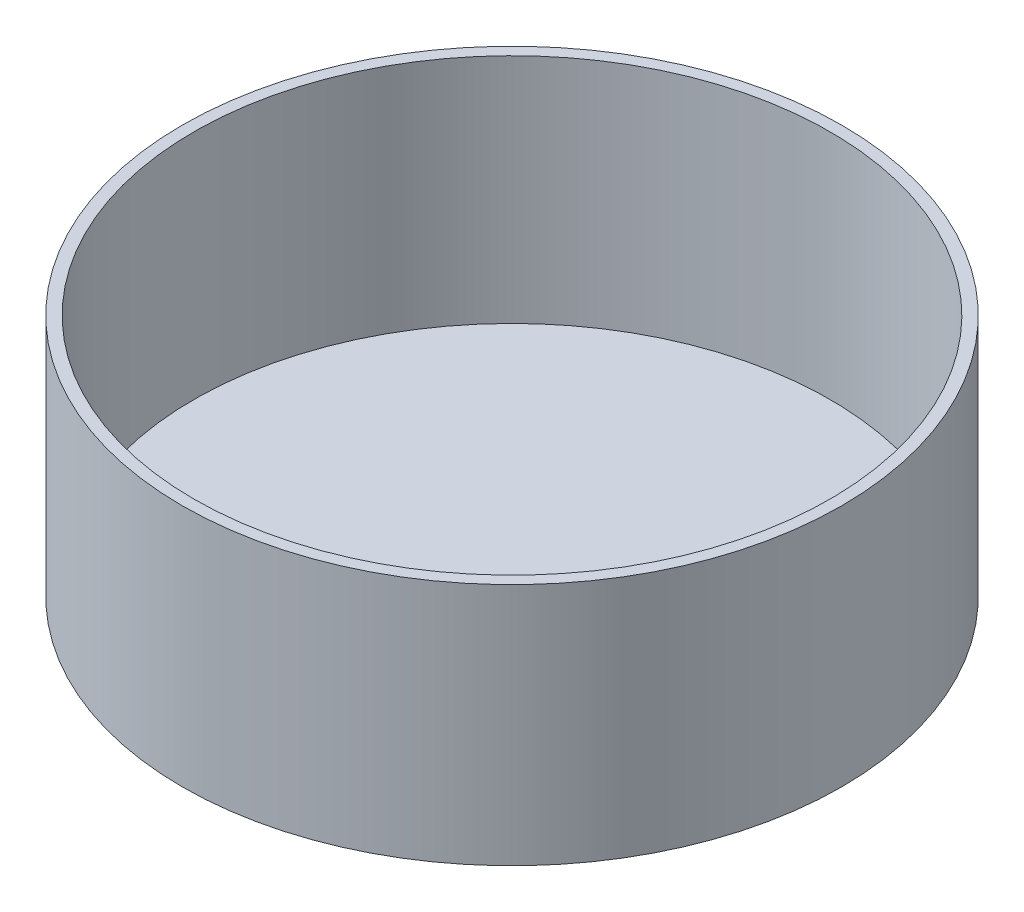
ISO-10303-21;
HEADER;
FILE_DESCRIPTION(('STEP AP214'),'2;1');
FILE_NAME('part.step','',(''),(''),'','','');
FILE_SCHEMA(('AUTOMOTIVE_DESIGN { 1 0 10303 214 1 1 1 1 }'));
ENDSEC;
DATA;
#1=APPLICATION_CONTEXT('core data for automotive mechanical design processes');
#2=APPLICATION_PROTOCOL_DEFINITION('international standard','automotive_design',2000,#1);
#3=PRODUCT_CONTEXT('',#1,'mechanical');
#4=PRODUCT('Part','Part','',(#3));
#5=PRODUCT_RELATED_PRODUCT_CATEGORY('part','',(#4));
#6=PRODUCT_DEFINITION_FORMATION('','',#4);
#7=PRODUCT_DEFINITION_CONTEXT('part definition',#1,'design');
#8=PRODUCT_DEFINITION('design','',#6,#7);
#9=PRODUCT_DEFINITION_SHAPE('','',#8);
#10=(LENGTH_UNIT() NAMED_UNIT(*) SI_UNIT(.MILLI.,.METRE.));
#11=(NAMED_UNIT(*) PLANE_ANGLE_UNIT() SI_UNIT($,.RADIAN.));
#12=(NAMED_UNIT(*) SI_UNIT($,.STERADIAN.) SOLID_ANGLE_UNIT());
#13=UNCERTAINTY_MEASURE_WITH_UNIT(LENGTH_MEASURE(1.E-05),#10,'distance_accuracy_value','');
#14=(GEOMETRIC_REPRESENTATION_CONTEXT(3) GLOBAL_UNCERTAINTY_ASSIGNED_CONTEXT((#13)) GLOBAL_UNIT_ASSIGNED_CONTEXT((#10,
#11,#12)) REPRESENTATION_CONTEXT('',''));
#15=CARTESIAN_POINT('',(0.,0.,0.));
#16=DIRECTION('',(0.,0.,1.));
#17=DIRECTION('',(1.,0.,0.));
#18=AXIS2_PLACEMENT_3D('',#15,#16,#17);
#19=CARTESIAN_POINT('',(0.,2.,0.));
#20=DIRECTION('',(0.,-1.,0.));
#21=DIRECTION('',(0.,0.,-1.));
#22=AXIS2_PLACEMENT_3D('',#19,#20,#21);
#23=CYLINDRICAL_SURFACE('',#22,56.875);
#24=CARTESIAN_POINT('',(0.,0.,0.));
#25=DIRECTION('',(0.,1.,0.));
#26=DIRECTION('',(0.,0.,1.));
#27=AXIS2_PLACEMENT_3D('',#24,#25,#26);
#28=CIRCLE('',#27,56.875);
#29=CARTESIAN_POINT('',(0.,0.,56.875));
#30=VERTEX_POINT('',#29);
#31=EDGE_CURVE('E46',#30,#30,#28,.T.);
#32=ORIENTED_EDGE('',*,*,#31,.T.);
#33=EDGE_LOOP('',(#32));
#34=FACE_BOUND('',#33,.T.);
#35=CARTESIAN_POINT('',(0.,42.,0.));
#36=DIRECTION('',(0.,1.,0.));
#37=DIRECTION('',(0.,0.,1.));
#38=AXIS2_PLACEMENT_3D('',#35,#36,#37);
#39=CIRCLE('',#38,56.875);
#40=CARTESIAN_POINT('',(0.,42.,56.875));
#41=VERTEX_POINT('',#40);
#42=EDGE_CURVE('E51',#41,#41,#39,.T.);
#43=ORIENTED_EDGE('',*,*,#42,.F.);
#44=EDGE_LOOP('',(#43));
#45=FACE_BOUND('',#44,.T.);
#46=ADVANCED_FACE('F39',(#34,#45),#23,.T.);
#47=CARTESIAN_POINT('',(0.,0.,0.));
#48=DIRECTION('',(0.,1.,0.));
#49=DIRECTION('',(0.,0.,1.));
#50=AXIS2_PLACEMENT_3D('',#47,#48,#49);
#51=PLANE('',#50);
#52=ORIENTED_EDGE('',*,*,#31,.F.);
#53=EDGE_LOOP('',(#52));
#54=FACE_BOUND('',#53,.T.);
#55=ADVANCED_FACE('F67',(#54),#51,.F.);
#56=CARTESIAN_POINT('',(0.,42.,0.));
#57=DIRECTION('',(0.,1.,0.));
#58=DIRECTION('',(0.,0.,1.));
#59=AXIS2_PLACEMENT_3D('',#56,#57,#58);
#60=PLANE('',#59);
#61=ORIENTED_EDGE('',*,*,#42,.T.);
#62=EDGE_LOOP('',(#61));
#63=FACE_BOUND('',#62,.T.);
#64=CARTESIAN_POINT('',(0.,42.,0.));
#65=DIRECTION('',(0.,1.,0.));
#66=DIRECTION('',(0.,0.,1.));
#67=AXIS2_PLACEMENT_3D('',#64,#65,#66);
#68=CIRCLE('',#67,54.875);
#69=CARTESIAN_POINT('',(0.,42.,54.875));
#70=VERTEX_POINT('',#69);
#71=EDGE_CURVE('E56',#70,#70,#68,.T.);
#72=ORIENTED_EDGE('',*,*,#71,.F.);
#73=EDGE_LOOP('',(#72));
#74=FACE_BOUND('',#73,.T.);
#75=ADVANCED_FACE('F65',(#63,#74),#60,.T.);
#76=CARTESIAN_POINT('',(0.,42.,0.));
#77=DIRECTION('',(0.,-1.,0.));
#78=DIRECTION('',(0.,0.,-1.));
#79=AXIS2_PLACEMENT_3D('',#76,#77,#78);
#80=CYLINDRICAL_SURFACE('',#79,54.875);
#81=ORIENTED_EDGE('',*,*,#71,.T.);
#82=EDGE_LOOP('',(#81));
#83=FACE_BOUND('',#82,.T.);
#84=CARTESIAN_POINT('',(0.,2.,0.));
#85=DIRECTION('',(0.,1.,0.));
#86=DIRECTION('',(0.,0.,1.));
#87=AXIS2_PLACEMENT_3D('',#84,#85,#86);
#88=CIRCLE('',#87,54.875);
#89=CARTESIAN_POINT('',(0.,2.,54.875));
#90=VERTEX_POINT('',#89);
#91=EDGE_CURVE('E10',#90,#90,#88,.F.);
#92=ORIENTED_EDGE('',*,*,#91,.T.);
#93=EDGE_LOOP('',(#92));
#94=FACE_BOUND('',#93,.T.);
#95=ADVANCED_FACE('F63',(#83,#94),#80,.F.);
#96=CARTESIAN_POINT('',(0.,2.,0.));
#97=DIRECTION('',(0.,1.,0.));
#98=DIRECTION('',(0.,0.,1.));
#99=AXIS2_PLACEMENT_3D('',#96,#97,#98);
#100=PLANE('',#99);
#101=ORIENTED_EDGE('',*,*,#91,.F.);
#102=EDGE_LOOP('',(#101));
#103=FACE_BOUND('',#102,.T.);
#104=ADVANCED_FACE('F74',(#103),#100,.T.);
#105=CLOSED_SHELL('',(#46,#55,#75,#95,#104));
#106=MANIFOLD_SOLID_BREP('B2',#105);
#107=ADVANCED_BREP_SHAPE_REPRESENTATION('',(#18,#106),#14);
#108=SHAPE_DEFINITION_REPRESENTATION(#9,#107);
ENDSEC;
END-ISO-10303-21;
